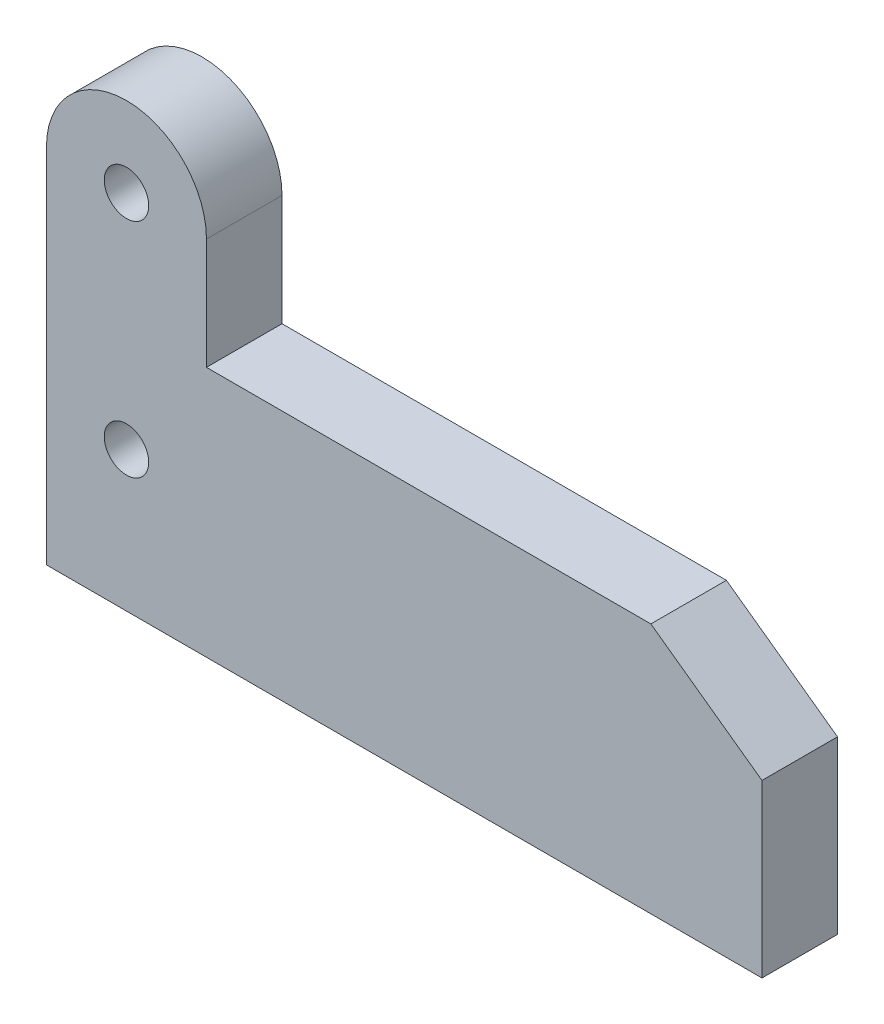
ISO-10303-21;
HEADER;
FILE_DESCRIPTION(('STEP AP214'),'2;1');
FILE_NAME('part.step','',(''),(''),'','','');
FILE_SCHEMA(('AUTOMOTIVE_DESIGN { 1 0 10303 214 1 1 1 1 }'));
ENDSEC;
DATA;
#1=APPLICATION_CONTEXT('core data for automotive mechanical design processes');
#2=APPLICATION_PROTOCOL_DEFINITION('international standard','automotive_design',2000,#1);
#3=PRODUCT_CONTEXT('',#1,'mechanical');
#4=PRODUCT('Part','Part','',(#3));
#5=PRODUCT_RELATED_PRODUCT_CATEGORY('part','',(#4));
#6=PRODUCT_DEFINITION_FORMATION('','',#4);
#7=PRODUCT_DEFINITION_CONTEXT('part definition',#1,'design');
#8=PRODUCT_DEFINITION('design','',#6,#7);
#9=PRODUCT_DEFINITION_SHAPE('','',#8);
#10=(LENGTH_UNIT() NAMED_UNIT(*) SI_UNIT(.MILLI.,.METRE.));
#11=(NAMED_UNIT(*) PLANE_ANGLE_UNIT() SI_UNIT($,.RADIAN.));
#12=(NAMED_UNIT(*) SI_UNIT($,.STERADIAN.) SOLID_ANGLE_UNIT());
#13=UNCERTAINTY_MEASURE_WITH_UNIT(LENGTH_MEASURE(1.E-05),#10,'distance_accuracy_value','');
#14=(GEOMETRIC_REPRESENTATION_CONTEXT(3) GLOBAL_UNCERTAINTY_ASSIGNED_CONTEXT((#13)) GLOBAL_UNIT_ASSIGNED_CONTEXT((#10,
#11,#12)) REPRESENTATION_CONTEXT('',''));
#15=CARTESIAN_POINT('',(0.,0.,0.));
#16=DIRECTION('',(0.,0.,1.));
#17=DIRECTION('',(1.,0.,0.));
#18=AXIS2_PLACEMENT_3D('',#15,#16,#17);
#19=CARTESIAN_POINT('',(0.,-10.,1.7));
#20=DIRECTION('',(0.,0.,1.));
#21=DIRECTION('',(1.,0.,0.));
#22=AXIS2_PLACEMENT_3D('',#19,#20,#21);
#23=PLANE('',#22);
#24=DIRECTION('',(0.,-1.,0.));
#25=VECTOR('',#24,1.);
#26=CARTESIAN_POINT('',(-3.6,0.,1.7));
#27=LINE('',#26,#25);
#28=CARTESIAN_POINT('',(-3.6,0.,1.7));
#29=VERTEX_POINT('',#28);
#30=CARTESIAN_POINT('',(-3.6,-16.3,1.7));
#31=VERTEX_POINT('',#30);
#32=EDGE_CURVE('E113',#29,#31,#27,.T.);
#33=ORIENTED_EDGE('',*,*,#32,.T.);
#34=DIRECTION('',(1.,0.,0.));
#35=VECTOR('',#34,1.);
#36=CARTESIAN_POINT('',(28.6,-16.3,1.7));
#37=LINE('',#36,#35);
#38=CARTESIAN_POINT('',(28.6,-16.3,1.7));
#39=VERTEX_POINT('',#38);
#40=EDGE_CURVE('E169',#31,#39,#37,.T.);
#41=ORIENTED_EDGE('',*,*,#40,.T.);
#42=DIRECTION('',(0.,1.,0.));
#43=VECTOR('',#42,1.);
#44=CARTESIAN_POINT('',(28.6,-13.6,1.7));
#45=LINE('',#44,#43);
#46=CARTESIAN_POINT('',(28.6,-8.6,1.7));
#47=VERTEX_POINT('',#46);
#48=EDGE_CURVE('E132',#39,#47,#45,.T.);
#49=ORIENTED_EDGE('',*,*,#48,.T.);
#50=DIRECTION('',(-0.811534341451495,0.584304725845075,0.));
#51=VECTOR('',#50,1.);
#52=CARTESIAN_POINT('',(28.6,-8.6,1.7));
#53=LINE('',#52,#51);
#54=CARTESIAN_POINT('',(23.6,-5.,1.7));
#55=VERTEX_POINT('',#54);
#56=EDGE_CURVE('E65',#47,#55,#53,.T.);
#57=ORIENTED_EDGE('',*,*,#56,.T.);
#58=DIRECTION('',(-1.,0.,0.));
#59=VECTOR('',#58,1.);
#60=CARTESIAN_POINT('',(3.6,-5.,1.7));
#61=LINE('',#60,#59);
#62=CARTESIAN_POINT('',(3.6,-5.,1.7));
#63=VERTEX_POINT('',#62);
#64=EDGE_CURVE('E150',#55,#63,#61,.T.);
#65=ORIENTED_EDGE('',*,*,#64,.T.);
#66=DIRECTION('',(0.,1.,0.));
#67=VECTOR('',#66,1.);
#68=CARTESIAN_POINT('',(3.6,0.,1.7));
#69=LINE('',#68,#67);
#70=CARTESIAN_POINT('',(3.6,0.,1.7));
#71=VERTEX_POINT('',#70);
#72=EDGE_CURVE('E100',#63,#71,#69,.T.);
#73=ORIENTED_EDGE('',*,*,#72,.T.);
#74=CARTESIAN_POINT('',(0.,0.,1.7));
#75=DIRECTION('',(0.,0.,1.));
#76=DIRECTION('',(1.,0.,0.));
#77=AXIS2_PLACEMENT_3D('',#74,#75,#76);
#78=CIRCLE('',#77,3.6);
#79=EDGE_CURVE('E107',#71,#29,#78,.T.);
#80=ORIENTED_EDGE('',*,*,#79,.T.);
#81=EDGE_LOOP('',(#33,#41,#49,#57,#65,#73,#80));
#82=FACE_BOUND('',#81,.T.);
#83=CARTESIAN_POINT('',(0.,0.,1.7));
#84=DIRECTION('',(0.,0.,1.));
#85=DIRECTION('',(1.,0.,0.));
#86=AXIS2_PLACEMENT_3D('',#83,#84,#85);
#87=CIRCLE('',#86,1.);
#88=CARTESIAN_POINT('',(1.,0.,1.7));
#89=VERTEX_POINT('',#88);
#90=EDGE_CURVE('E143',#89,#89,#87,.T.);
#91=ORIENTED_EDGE('',*,*,#90,.F.);
#92=EDGE_LOOP('',(#91));
#93=FACE_BOUND('',#92,.T.);
#94=CARTESIAN_POINT('',(0.,-10.,1.7));
#95=DIRECTION('',(0.,0.,1.));
#96=DIRECTION('',(1.,0.,0.));
#97=AXIS2_PLACEMENT_3D('',#94,#95,#96);
#98=CIRCLE('',#97,1.);
#99=CARTESIAN_POINT('',(1.,-10.,1.7));
#100=VERTEX_POINT('',#99);
#101=EDGE_CURVE('E175',#100,#100,#98,.T.);
#102=ORIENTED_EDGE('',*,*,#101,.F.);
#103=EDGE_LOOP('',(#102));
#104=FACE_BOUND('',#103,.T.);
#105=ADVANCED_FACE('F48',(#82,#93,#104),#23,.T.);
#106=CARTESIAN_POINT('',(0.,-10.,-1.7));
#107=DIRECTION('',(0.,0.,1.));
#108=DIRECTION('',(1.,0.,0.));
#109=AXIS2_PLACEMENT_3D('',#106,#107,#108);
#110=PLANE('',#109);
#111=DIRECTION('',(0.,1.,0.));
#112=VECTOR('',#111,1.);
#113=CARTESIAN_POINT('',(28.6,-13.6,-1.7));
#114=LINE('',#113,#112);
#115=CARTESIAN_POINT('',(28.6,-16.3,-1.7));
#116=VERTEX_POINT('',#115);
#117=CARTESIAN_POINT('',(28.6,-8.6,-1.7));
#118=VERTEX_POINT('',#117);
#119=EDGE_CURVE('E86',#116,#118,#114,.T.);
#120=ORIENTED_EDGE('',*,*,#119,.F.);
#121=DIRECTION('',(-1.,0.,0.));
#122=VECTOR('',#121,1.);
#123=CARTESIAN_POINT('',(28.6,-16.3,-1.7));
#124=LINE('',#123,#122);
#125=CARTESIAN_POINT('',(-3.6,-16.3,-1.7));
#126=VERTEX_POINT('',#125);
#127=EDGE_CURVE('E158',#116,#126,#124,.T.);
#128=ORIENTED_EDGE('',*,*,#127,.T.);
#129=DIRECTION('',(0.,-1.,0.));
#130=VECTOR('',#129,1.);
#131=CARTESIAN_POINT('',(-3.6,0.,-1.7));
#132=LINE('',#131,#130);
#133=CARTESIAN_POINT('',(-3.6,0.,-1.7));
#134=VERTEX_POINT('',#133);
#135=EDGE_CURVE('E146',#134,#126,#132,.T.);
#136=ORIENTED_EDGE('',*,*,#135,.F.);
#137=CARTESIAN_POINT('',(0.,0.,-1.7));
#138=DIRECTION('',(0.,0.,1.));
#139=DIRECTION('',(1.,0.,0.));
#140=AXIS2_PLACEMENT_3D('',#137,#138,#139);
#141=CIRCLE('',#140,3.6);
#142=CARTESIAN_POINT('',(3.6,0.,-1.7));
#143=VERTEX_POINT('',#142);
#144=EDGE_CURVE('E122',#143,#134,#141,.T.);
#145=ORIENTED_EDGE('',*,*,#144,.F.);
#146=DIRECTION('',(0.,1.,0.));
#147=VECTOR('',#146,1.);
#148=CARTESIAN_POINT('',(3.6,0.,-1.7));
#149=LINE('',#148,#147);
#150=CARTESIAN_POINT('',(3.6,-5.,-1.7));
#151=VERTEX_POINT('',#150);
#152=EDGE_CURVE('E142',#151,#143,#149,.T.);
#153=ORIENTED_EDGE('',*,*,#152,.F.);
#154=DIRECTION('',(-1.,0.,0.));
#155=VECTOR('',#154,1.);
#156=CARTESIAN_POINT('',(3.6,-5.,-1.7));
#157=LINE('',#156,#155);
#158=CARTESIAN_POINT('',(23.6,-5.,-1.7));
#159=VERTEX_POINT('',#158);
#160=EDGE_CURVE('E139',#159,#151,#157,.T.);
#161=ORIENTED_EDGE('',*,*,#160,.F.);
#162=DIRECTION('',(-0.811534341451495,0.584304725845075,0.));
#163=VECTOR('',#162,1.);
#164=CARTESIAN_POINT('',(28.6,-8.6,-1.7));
#165=LINE('',#164,#163);
#166=EDGE_CURVE('E92',#118,#159,#165,.T.);
#167=ORIENTED_EDGE('',*,*,#166,.F.);
#168=EDGE_LOOP('',(#120,#128,#136,#145,#153,#161,#167));
#169=FACE_BOUND('',#168,.T.);
#170=CARTESIAN_POINT('',(0.,0.,-1.7));
#171=DIRECTION('',(0.,0.,1.));
#172=DIRECTION('',(1.,0.,0.));
#173=AXIS2_PLACEMENT_3D('',#170,#171,#172);
#174=CIRCLE('',#173,1.);
#175=CARTESIAN_POINT('',(1.,0.,-1.7));
#176=VERTEX_POINT('',#175);
#177=EDGE_CURVE('E178',#176,#176,#174,.T.);
#178=ORIENTED_EDGE('',*,*,#177,.T.);
#179=EDGE_LOOP('',(#178));
#180=FACE_BOUND('',#179,.T.);
#181=CARTESIAN_POINT('',(0.,-10.,-1.7));
#182=DIRECTION('',(0.,0.,1.));
#183=DIRECTION('',(1.,0.,0.));
#184=AXIS2_PLACEMENT_3D('',#181,#182,#183);
#185=CIRCLE('',#184,1.);
#186=CARTESIAN_POINT('',(1.,-10.,-1.7));
#187=VERTEX_POINT('',#186);
#188=EDGE_CURVE('E179',#187,#187,#185,.T.);
#189=ORIENTED_EDGE('',*,*,#188,.T.);
#190=EDGE_LOOP('',(#189));
#191=FACE_BOUND('',#190,.T.);
#192=ADVANCED_FACE('F153',(#169,#180,#191),#110,.F.);
#193=CARTESIAN_POINT('',(3.6,-5.,1.7));
#194=DIRECTION('',(0.,-1.,0.));
#195=DIRECTION('',(0.,0.,-1.));
#196=AXIS2_PLACEMENT_3D('',#193,#194,#195);
#197=PLANE('',#196);
#198=ORIENTED_EDGE('',*,*,#160,.T.);
#199=DIRECTION('',(0.,0.,-1.));
#200=VECTOR('',#199,1.);
#201=CARTESIAN_POINT('',(3.6,-5.,1.7));
#202=LINE('',#201,#200);
#203=EDGE_CURVE('E13',#63,#151,#202,.T.);
#204=ORIENTED_EDGE('',*,*,#203,.F.);
#205=ORIENTED_EDGE('',*,*,#64,.F.);
#206=DIRECTION('',(0.,0.,-1.));
#207=VECTOR('',#206,1.);
#208=CARTESIAN_POINT('',(23.6,-5.,1.7));
#209=LINE('',#208,#207);
#210=EDGE_CURVE('E138',#55,#159,#209,.T.);
#211=ORIENTED_EDGE('',*,*,#210,.T.);
#212=EDGE_LOOP('',(#198,#204,#205,#211));
#213=FACE_BOUND('',#212,.T.);
#214=ADVANCED_FACE('F50',(#213),#197,.F.);
#215=CARTESIAN_POINT('',(3.6,0.,1.7));
#216=DIRECTION('',(-1.,0.,0.));
#217=DIRECTION('',(0.,0.,1.));
#218=AXIS2_PLACEMENT_3D('',#215,#216,#217);
#219=PLANE('',#218);
#220=ORIENTED_EDGE('',*,*,#152,.T.);
#221=DIRECTION('',(0.,0.,-1.));
#222=VECTOR('',#221,1.);
#223=CARTESIAN_POINT('',(3.6,0.,1.7));
#224=LINE('',#223,#222);
#225=EDGE_CURVE('E57',#71,#143,#224,.T.);
#226=ORIENTED_EDGE('',*,*,#225,.F.);
#227=ORIENTED_EDGE('',*,*,#72,.F.);
#228=ORIENTED_EDGE('',*,*,#203,.T.);
#229=EDGE_LOOP('',(#220,#226,#227,#228));
#230=FACE_BOUND('',#229,.T.);
#231=ADVANCED_FACE('F189',(#230),#219,.F.);
#232=CARTESIAN_POINT('',(0.,0.,1.7));
#233=DIRECTION('',(0.,0.,-1.));
#234=DIRECTION('',(-1.,0.,0.));
#235=AXIS2_PLACEMENT_3D('',#232,#233,#234);
#236=CYLINDRICAL_SURFACE('',#235,3.6);
#237=ORIENTED_EDGE('',*,*,#144,.T.);
#238=DIRECTION('',(0.,0.,-1.));
#239=VECTOR('',#238,1.);
#240=CARTESIAN_POINT('',(-3.6,0.,1.7));
#241=LINE('',#240,#239);
#242=EDGE_CURVE('E119',#29,#134,#241,.T.);
#243=ORIENTED_EDGE('',*,*,#242,.F.);
#244=ORIENTED_EDGE('',*,*,#79,.F.);
#245=ORIENTED_EDGE('',*,*,#225,.T.);
#246=EDGE_LOOP('',(#237,#243,#244,#245));
#247=FACE_BOUND('',#246,.T.);
#248=ADVANCED_FACE('F120',(#247),#236,.T.);
#249=CARTESIAN_POINT('',(-3.6,0.,1.7));
#250=DIRECTION('',(1.,0.,0.));
#251=DIRECTION('',(0.,0.,-1.));
#252=AXIS2_PLACEMENT_3D('',#249,#250,#251);
#253=PLANE('',#252);
#254=ORIENTED_EDGE('',*,*,#135,.T.);
#255=DIRECTION('',(0.,0.,1.));
#256=VECTOR('',#255,1.);
#257=CARTESIAN_POINT('',(-3.6,-16.3,-34.5105166067223));
#258=LINE('',#257,#256);
#259=EDGE_CURVE('E130',#126,#31,#258,.T.);
#260=ORIENTED_EDGE('',*,*,#259,.T.);
#261=ORIENTED_EDGE('',*,*,#32,.F.);
#262=ORIENTED_EDGE('',*,*,#242,.T.);
#263=EDGE_LOOP('',(#254,#260,#261,#262));
#264=FACE_BOUND('',#263,.T.);
#265=ADVANCED_FACE('F128',(#264),#253,.F.);
#266=CARTESIAN_POINT('',(28.6,-13.6,1.7));
#267=DIRECTION('',(-1.,0.,0.));
#268=DIRECTION('',(0.,-1.,0.));
#269=AXIS2_PLACEMENT_3D('',#266,#267,#268);
#270=PLANE('',#269);
#271=ORIENTED_EDGE('',*,*,#48,.F.);
#272=DIRECTION('',(0.,0.,1.));
#273=VECTOR('',#272,1.);
#274=CARTESIAN_POINT('',(28.6,-16.3,-34.5105166067223));
#275=LINE('',#274,#273);
#276=EDGE_CURVE('E166',#116,#39,#275,.T.);
#277=ORIENTED_EDGE('',*,*,#276,.F.);
#278=ORIENTED_EDGE('',*,*,#119,.T.);
#279=DIRECTION('',(0.,0.,-1.));
#280=VECTOR('',#279,1.);
#281=CARTESIAN_POINT('',(28.6,-8.6,1.7));
#282=LINE('',#281,#280);
#283=EDGE_CURVE('E126',#47,#118,#282,.T.);
#284=ORIENTED_EDGE('',*,*,#283,.F.);
#285=EDGE_LOOP('',(#271,#277,#278,#284));
#286=FACE_BOUND('',#285,.T.);
#287=ADVANCED_FACE('F165',(#286),#270,.F.);
#288=CARTESIAN_POINT('',(28.6,-8.6,1.7));
#289=DIRECTION('',(-0.584304725845075,-0.811534341451495,0.));
#290=DIRECTION('',(0.811534341451495,-0.584304725845075,0.));
#291=AXIS2_PLACEMENT_3D('',#288,#289,#290);
#292=PLANE('',#291);
#293=ORIENTED_EDGE('',*,*,#166,.T.);
#294=ORIENTED_EDGE('',*,*,#210,.F.);
#295=ORIENTED_EDGE('',*,*,#56,.F.);
#296=ORIENTED_EDGE('',*,*,#283,.T.);
#297=EDGE_LOOP('',(#293,#294,#295,#296));
#298=FACE_BOUND('',#297,.T.);
#299=ADVANCED_FACE('F206',(#298),#292,.F.);
#300=CARTESIAN_POINT('',(0.,0.,1.7));
#301=DIRECTION('',(0.,0.,-1.));
#302=DIRECTION('',(-1.,0.,0.));
#303=AXIS2_PLACEMENT_3D('',#300,#301,#302);
#304=CYLINDRICAL_SURFACE('',#303,1.);
#305=ORIENTED_EDGE('',*,*,#90,.T.);
#306=EDGE_LOOP('',(#305));
#307=FACE_BOUND('',#306,.T.);
#308=ORIENTED_EDGE('',*,*,#177,.F.);
#309=EDGE_LOOP('',(#308));
#310=FACE_BOUND('',#309,.T.);
#311=ADVANCED_FACE('F203',(#307,#310),#304,.F.);
#312=CARTESIAN_POINT('',(0.,-10.,1.7));
#313=DIRECTION('',(0.,0.,-1.));
#314=DIRECTION('',(-1.,0.,0.));
#315=AXIS2_PLACEMENT_3D('',#312,#313,#314);
#316=CYLINDRICAL_SURFACE('',#315,1.);
#317=ORIENTED_EDGE('',*,*,#101,.T.);
#318=EDGE_LOOP('',(#317));
#319=FACE_BOUND('',#318,.T.);
#320=ORIENTED_EDGE('',*,*,#188,.F.);
#321=EDGE_LOOP('',(#320));
#322=FACE_BOUND('',#321,.T.);
#323=ADVANCED_FACE('F232',(#319,#322),#316,.F.);
#324=CARTESIAN_POINT('',(28.6,-16.3,-34.5105166067223));
#325=DIRECTION('',(0.,-1.,0.));
#326=DIRECTION('',(1.,0.,0.));
#327=AXIS2_PLACEMENT_3D('',#324,#325,#326);
#328=PLANE('',#327);
#329=ORIENTED_EDGE('',*,*,#127,.F.);
#330=ORIENTED_EDGE('',*,*,#276,.T.);
#331=ORIENTED_EDGE('',*,*,#40,.F.);
#332=ORIENTED_EDGE('',*,*,#259,.F.);
#333=EDGE_LOOP('',(#329,#330,#331,#332));
#334=FACE_BOUND('',#333,.T.);
#335=ADVANCED_FACE('F168',(#334),#328,.T.);
#336=CLOSED_SHELL('',(#105,#192,#214,#231,#248,#265,#287,#299,#311,#323,#335));
#337=MANIFOLD_SOLID_BREP('B2',#336);
#338=ADVANCED_BREP_SHAPE_REPRESENTATION('',(#18,#337),#14);
#339=SHAPE_DEFINITION_REPRESENTATION(#9,#338);
ENDSEC;
END-ISO-10303-21;
